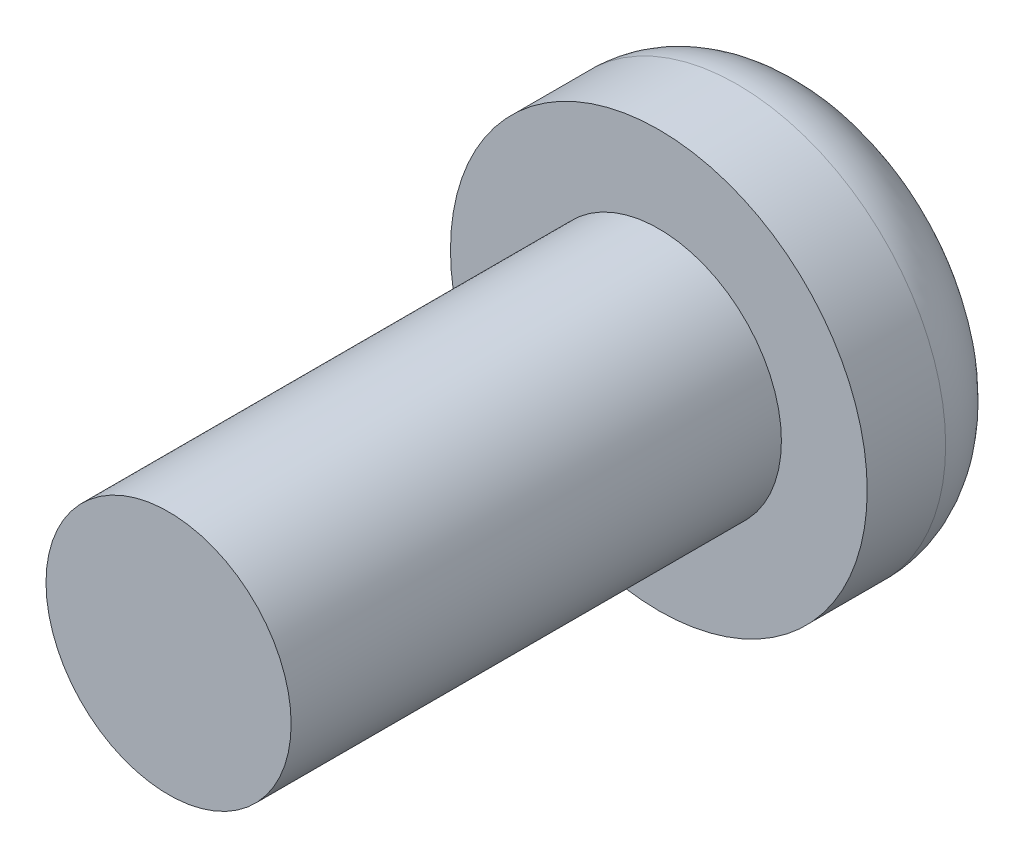
ISO-10303-21;
HEADER;
FILE_DESCRIPTION(('STEP AP214'),'2;1');
FILE_NAME('part.step','',(''),(''),'','','');
FILE_SCHEMA(('AUTOMOTIVE_DESIGN { 1 0 10303 214 1 1 1 1 }'));
ENDSEC;
DATA;
#1=APPLICATION_CONTEXT('core data for automotive mechanical design processes');
#2=APPLICATION_PROTOCOL_DEFINITION('international standard','automotive_design',2000,#1);
#3=PRODUCT_CONTEXT('',#1,'mechanical');
#4=PRODUCT('Part','Part','',(#3));
#5=PRODUCT_RELATED_PRODUCT_CATEGORY('part','',(#4));
#6=PRODUCT_DEFINITION_FORMATION('','',#4);
#7=PRODUCT_DEFINITION_CONTEXT('part definition',#1,'design');
#8=PRODUCT_DEFINITION('design','',#6,#7);
#9=PRODUCT_DEFINITION_SHAPE('','',#8);
#10=(LENGTH_UNIT() NAMED_UNIT(*) SI_UNIT(.MILLI.,.METRE.));
#11=(NAMED_UNIT(*) PLANE_ANGLE_UNIT() SI_UNIT($,.RADIAN.));
#12=(NAMED_UNIT(*) SI_UNIT($,.STERADIAN.) SOLID_ANGLE_UNIT());
#13=UNCERTAINTY_MEASURE_WITH_UNIT(LENGTH_MEASURE(1.E-05),#10,'distance_accuracy_value','');
#14=(GEOMETRIC_REPRESENTATION_CONTEXT(3) GLOBAL_UNCERTAINTY_ASSIGNED_CONTEXT((#13)) GLOBAL_UNIT_ASSIGNED_CONTEXT((#10,
#11,#12)) REPRESENTATION_CONTEXT('',''));
#15=CARTESIAN_POINT('',(0.,0.,0.));
#16=DIRECTION('',(0.,0.,1.));
#17=DIRECTION('',(1.,0.,0.));
#18=AXIS2_PLACEMENT_3D('',#15,#16,#17);
#19=CARTESIAN_POINT('',(0.,0.,3.2));
#20=DIRECTION('',(0.,0.,-1.));
#21=DIRECTION('',(-1.,0.,0.));
#22=AXIS2_PLACEMENT_3D('',#19,#20,#21);
#23=CYLINDRICAL_SURFACE('',#22,4.25);
#24=CARTESIAN_POINT('',(0.,0.,3.2));
#25=DIRECTION('',(0.,0.,1.));
#26=DIRECTION('',(1.,0.,0.));
#27=AXIS2_PLACEMENT_3D('',#24,#25,#26);
#28=CIRCLE('',#27,4.25);
#29=CARTESIAN_POINT('',(4.25,0.,3.2));
#30=VERTEX_POINT('',#29);
#31=EDGE_CURVE('E42',#30,#30,#28,.T.);
#32=ORIENTED_EDGE('',*,*,#31,.F.);
#33=EDGE_LOOP('',(#32));
#34=FACE_BOUND('',#33,.T.);
#35=CARTESIAN_POINT('',(0.,0.,1.6));
#36=DIRECTION('',(0.,0.,-1.));
#37=DIRECTION('',(-1.,0.,0.));
#38=AXIS2_PLACEMENT_3D('',#35,#36,#37);
#39=CIRCLE('',#38,4.25);
#40=CARTESIAN_POINT('',(-4.25,0.,1.6));
#41=VERTEX_POINT('',#40);
#42=EDGE_CURVE('E218',#41,#41,#39,.T.);
#43=ORIENTED_EDGE('',*,*,#42,.F.);
#44=EDGE_LOOP('',(#43));
#45=FACE_BOUND('',#44,.T.);
#46=ADVANCED_FACE('F39',(#34,#45),#23,.T.);
#47=CARTESIAN_POINT('',(0.,0.,3.2));
#48=DIRECTION('',(0.,0.,1.));
#49=DIRECTION('',(1.,0.,0.));
#50=AXIS2_PLACEMENT_3D('',#47,#48,#49);
#51=PLANE('',#50);
#52=CARTESIAN_POINT('',(0.,0.,3.2));
#53=DIRECTION('',(0.,0.,1.));
#54=DIRECTION('',(1.,0.,0.));
#55=AXIS2_PLACEMENT_3D('',#52,#53,#54);
#56=CIRCLE('',#55,2.5);
#57=CARTESIAN_POINT('',(2.5,0.,3.2));
#58=VERTEX_POINT('',#57);
#59=EDGE_CURVE('E11',#58,#58,#56,.T.);
#60=ORIENTED_EDGE('',*,*,#59,.F.);
#61=EDGE_LOOP('',(#60));
#62=FACE_BOUND('',#61,.T.);
#63=ORIENTED_EDGE('',*,*,#31,.T.);
#64=EDGE_LOOP('',(#63));
#65=FACE_BOUND('',#64,.T.);
#66=ADVANCED_FACE('F257',(#62,#65),#51,.T.);
#67=CARTESIAN_POINT('',(0.,0.,1.6));
#68=DIRECTION('',(0.,0.,-1.));
#69=DIRECTION('',(-1.,0.,0.));
#70=AXIS2_PLACEMENT_3D('',#67,#68,#69);
#71=TOROIDAL_SURFACE('',#70,2.65,1.6);
#72=CARTESIAN_POINT('',(0.,0.,0.));
#73=DIRECTION('',(0.,0.,-1.));
#74=DIRECTION('',(-1.,0.,0.));
#75=AXIS2_PLACEMENT_3D('',#72,#73,#74);
#76=CIRCLE('',#75,2.65);
#77=CARTESIAN_POINT('',(-2.65,0.,0.));
#78=VERTEX_POINT('',#77);
#79=EDGE_CURVE('E248',#78,#78,#76,.T.);
#80=ORIENTED_EDGE('',*,*,#79,.F.);
#81=EDGE_LOOP('',(#80));
#82=FACE_BOUND('',#81,.T.);
#83=ORIENTED_EDGE('',*,*,#42,.T.);
#84=EDGE_LOOP('',(#83));
#85=FACE_BOUND('',#84,.T.);
#86=ADVANCED_FACE('F263',(#82,#85),#71,.T.);
#87=CARTESIAN_POINT('',(0.,0.,0.));
#88=DIRECTION('',(0.,0.,1.));
#89=DIRECTION('',(1.,0.,0.));
#90=AXIS2_PLACEMENT_3D('',#87,#88,#89);
#91=PLANE('',#90);
#92=DIRECTION('',(-1.,0.,0.));
#93=VECTOR('',#92,1.);
#94=CARTESIAN_POINT('',(0.,0.5,0.));
#95=LINE('',#94,#93);
#96=CARTESIAN_POINT('',(2.,0.5,0.));
#97=VERTEX_POINT('',#96);
#98=CARTESIAN_POINT('',(0.5,0.5,0.));
#99=VERTEX_POINT('',#98);
#100=EDGE_CURVE('E173',#97,#99,#95,.T.);
#101=ORIENTED_EDGE('',*,*,#100,.T.);
#102=DIRECTION('',(0.,-1.,0.));
#103=VECTOR('',#102,1.);
#104=CARTESIAN_POINT('',(0.5,0.,0.));
#105=LINE('',#104,#103);
#106=CARTESIAN_POINT('',(0.5,2.,0.));
#107=VERTEX_POINT('',#106);
#108=EDGE_CURVE('E55',#107,#99,#105,.T.);
#109=ORIENTED_EDGE('',*,*,#108,.F.);
#110=DIRECTION('',(-1.,0.,0.));
#111=VECTOR('',#110,1.);
#112=CARTESIAN_POINT('',(0.,2.,0.));
#113=LINE('',#112,#111);
#114=CARTESIAN_POINT('',(-0.5,2.,0.));
#115=VERTEX_POINT('',#114);
#116=EDGE_CURVE('E211',#107,#115,#113,.T.);
#117=ORIENTED_EDGE('',*,*,#116,.T.);
#118=DIRECTION('',(0.,-1.,0.));
#119=VECTOR('',#118,1.);
#120=CARTESIAN_POINT('',(-0.5,0.,0.));
#121=LINE('',#120,#119);
#122=CARTESIAN_POINT('',(-0.5,0.5,0.));
#123=VERTEX_POINT('',#122);
#124=EDGE_CURVE('E208',#115,#123,#121,.T.);
#125=ORIENTED_EDGE('',*,*,#124,.T.);
#126=DIRECTION('',(-1.,0.,0.));
#127=VECTOR('',#126,1.);
#128=CARTESIAN_POINT('',(0.,0.5,0.));
#129=LINE('',#128,#127);
#130=CARTESIAN_POINT('',(-2.,0.5,0.));
#131=VERTEX_POINT('',#130);
#132=EDGE_CURVE('E151',#123,#131,#129,.T.);
#133=ORIENTED_EDGE('',*,*,#132,.T.);
#134=DIRECTION('',(0.,-1.,0.));
#135=VECTOR('',#134,1.);
#136=CARTESIAN_POINT('',(-2.,0.,0.));
#137=LINE('',#136,#135);
#138=CARTESIAN_POINT('',(-2.,-0.5,0.));
#139=VERTEX_POINT('',#138);
#140=EDGE_CURVE('E202',#131,#139,#137,.T.);
#141=ORIENTED_EDGE('',*,*,#140,.T.);
#142=DIRECTION('',(-1.,0.,0.));
#143=VECTOR('',#142,1.);
#144=CARTESIAN_POINT('',(0.,-0.5,0.));
#145=LINE('',#144,#143);
#146=CARTESIAN_POINT('',(-0.500000000000001,-0.5,0.));
#147=VERTEX_POINT('',#146);
#148=EDGE_CURVE('E198',#147,#139,#145,.T.);
#149=ORIENTED_EDGE('',*,*,#148,.F.);
#150=DIRECTION('',(0.,-1.,0.));
#151=VECTOR('',#150,1.);
#152=CARTESIAN_POINT('',(-0.5,0.,0.));
#153=LINE('',#152,#151);
#154=CARTESIAN_POINT('',(-0.500000000000001,-2.,0.));
#155=VERTEX_POINT('',#154);
#156=EDGE_CURVE('E194',#147,#155,#153,.T.);
#157=ORIENTED_EDGE('',*,*,#156,.T.);
#158=DIRECTION('',(-1.,0.,0.));
#159=VECTOR('',#158,1.);
#160=CARTESIAN_POINT('',(0.,-2.,0.));
#161=LINE('',#160,#159);
#162=CARTESIAN_POINT('',(0.499999999999999,-2.,0.));
#163=VERTEX_POINT('',#162);
#164=EDGE_CURVE('E190',#163,#155,#161,.T.);
#165=ORIENTED_EDGE('',*,*,#164,.F.);
#166=DIRECTION('',(0.,-1.,0.));
#167=VECTOR('',#166,1.);
#168=CARTESIAN_POINT('',(0.5,0.,0.));
#169=LINE('',#168,#167);
#170=CARTESIAN_POINT('',(0.499999999999999,-0.5,0.));
#171=VERTEX_POINT('',#170);
#172=EDGE_CURVE('E186',#171,#163,#169,.T.);
#173=ORIENTED_EDGE('',*,*,#172,.F.);
#174=DIRECTION('',(-1.,0.,0.));
#175=VECTOR('',#174,1.);
#176=CARTESIAN_POINT('',(0.,-0.5,0.));
#177=LINE('',#176,#175);
#178=CARTESIAN_POINT('',(2.,-0.5,0.));
#179=VERTEX_POINT('',#178);
#180=EDGE_CURVE('E182',#179,#171,#177,.T.);
#181=ORIENTED_EDGE('',*,*,#180,.F.);
#182=DIRECTION('',(0.,-1.,0.));
#183=VECTOR('',#182,1.);
#184=CARTESIAN_POINT('',(2.,0.,0.));
#185=LINE('',#184,#183);
#186=EDGE_CURVE('E178',#97,#179,#185,.T.);
#187=ORIENTED_EDGE('',*,*,#186,.F.);
#188=EDGE_LOOP('',(#101,#109,#117,#125,#133,#141,#149,#157,#165,#173,#181,#187));
#189=FACE_BOUND('',#188,.T.);
#190=ORIENTED_EDGE('',*,*,#79,.T.);
#191=EDGE_LOOP('',(#190));
#192=FACE_BOUND('',#191,.T.);
#193=ADVANCED_FACE('F265',(#189,#192),#91,.F.);
#194=CARTESIAN_POINT('',(0.5,0.,0.5));
#195=DIRECTION('',(1.,0.,0.));
#196=DIRECTION('',(0.,1.,0.));
#197=AXIS2_PLACEMENT_3D('',#194,#195,#196);
#198=PLANE('',#197);
#199=ORIENTED_EDGE('',*,*,#108,.T.);
#200=DIRECTION('',(0.,0.,-1.));
#201=VECTOR('',#200,1.);
#202=CARTESIAN_POINT('',(0.5,0.5,0.5));
#203=LINE('',#202,#201);
#204=CARTESIAN_POINT('',(0.5,0.5,0.5));
#205=VERTEX_POINT('',#204);
#206=EDGE_CURVE('E170',#205,#99,#203,.T.);
#207=ORIENTED_EDGE('',*,*,#206,.F.);
#208=DIRECTION('',(0.,-1.,0.));
#209=VECTOR('',#208,1.);
#210=CARTESIAN_POINT('',(0.5,0.,0.5));
#211=LINE('',#210,#209);
#212=CARTESIAN_POINT('',(0.5,2.,0.5));
#213=VERTEX_POINT('',#212);
#214=EDGE_CURVE('E215',#213,#205,#211,.T.);
#215=ORIENTED_EDGE('',*,*,#214,.F.);
#216=DIRECTION('',(0.,0.,-1.));
#217=VECTOR('',#216,1.);
#218=CARTESIAN_POINT('',(0.5,2.,0.5));
#219=LINE('',#218,#217);
#220=EDGE_CURVE('E63',#213,#107,#219,.T.);
#221=ORIENTED_EDGE('',*,*,#220,.T.);
#222=EDGE_LOOP('',(#199,#207,#215,#221));
#223=FACE_BOUND('',#222,.T.);
#224=ADVANCED_FACE('F272',(#223),#198,.F.);
#225=CARTESIAN_POINT('',(0.,2.,0.5));
#226=DIRECTION('',(0.,-1.,0.));
#227=DIRECTION('',(1.,0.,0.));
#228=AXIS2_PLACEMENT_3D('',#225,#226,#227);
#229=PLANE('',#228);
#230=ORIENTED_EDGE('',*,*,#116,.F.);
#231=ORIENTED_EDGE('',*,*,#220,.F.);
#232=DIRECTION('',(-1.,0.,0.));
#233=VECTOR('',#232,1.);
#234=CARTESIAN_POINT('',(0.,2.,0.5));
#235=LINE('',#234,#233);
#236=CARTESIAN_POINT('',(-0.5,2.,0.5));
#237=VERTEX_POINT('',#236);
#238=EDGE_CURVE('E144',#213,#237,#235,.T.);
#239=ORIENTED_EDGE('',*,*,#238,.T.);
#240=DIRECTION('',(0.,0.,-1.));
#241=VECTOR('',#240,1.);
#242=CARTESIAN_POINT('',(-0.5,2.,0.5));
#243=LINE('',#242,#241);
#244=EDGE_CURVE('E140',#237,#115,#243,.T.);
#245=ORIENTED_EDGE('',*,*,#244,.T.);
#246=EDGE_LOOP('',(#230,#231,#239,#245));
#247=FACE_BOUND('',#246,.T.);
#248=ADVANCED_FACE('F279',(#247),#229,.T.);
#249=CARTESIAN_POINT('',(-0.5,0.,0.5));
#250=DIRECTION('',(1.,0.,0.));
#251=DIRECTION('',(0.,1.,0.));
#252=AXIS2_PLACEMENT_3D('',#249,#250,#251);
#253=PLANE('',#252);
#254=ORIENTED_EDGE('',*,*,#124,.F.);
#255=ORIENTED_EDGE('',*,*,#244,.F.);
#256=DIRECTION('',(0.,-1.,0.));
#257=VECTOR('',#256,1.);
#258=CARTESIAN_POINT('',(-0.5,0.,0.5));
#259=LINE('',#258,#257);
#260=CARTESIAN_POINT('',(-0.5,0.5,0.5));
#261=VERTEX_POINT('',#260);
#262=EDGE_CURVE('E134',#237,#261,#259,.T.);
#263=ORIENTED_EDGE('',*,*,#262,.T.);
#264=DIRECTION('',(0.,0.,-1.));
#265=VECTOR('',#264,1.);
#266=CARTESIAN_POINT('',(-0.5,0.5,0.5));
#267=LINE('',#266,#265);
#268=EDGE_CURVE('E138',#261,#123,#267,.T.);
#269=ORIENTED_EDGE('',*,*,#268,.T.);
#270=EDGE_LOOP('',(#254,#255,#263,#269));
#271=FACE_BOUND('',#270,.T.);
#272=ADVANCED_FACE('F137',(#271),#253,.T.);
#273=CARTESIAN_POINT('',(0.,0.5,0.5));
#274=DIRECTION('',(0.,-1.,0.));
#275=DIRECTION('',(1.,0.,0.));
#276=AXIS2_PLACEMENT_3D('',#273,#274,#275);
#277=PLANE('',#276);
#278=ORIENTED_EDGE('',*,*,#132,.F.);
#279=ORIENTED_EDGE('',*,*,#268,.F.);
#280=DIRECTION('',(-1.,0.,0.));
#281=VECTOR('',#280,1.);
#282=CARTESIAN_POINT('',(0.,0.5,0.5));
#283=LINE('',#282,#281);
#284=CARTESIAN_POINT('',(-2.,0.5,0.5));
#285=VERTEX_POINT('',#284);
#286=EDGE_CURVE('E145',#261,#285,#283,.T.);
#287=ORIENTED_EDGE('',*,*,#286,.T.);
#288=DIRECTION('',(0.,0.,-1.));
#289=VECTOR('',#288,1.);
#290=CARTESIAN_POINT('',(-2.,0.5,0.5));
#291=LINE('',#290,#289);
#292=EDGE_CURVE('E154',#285,#131,#291,.T.);
#293=ORIENTED_EDGE('',*,*,#292,.T.);
#294=EDGE_LOOP('',(#278,#279,#287,#293));
#295=FACE_BOUND('',#294,.T.);
#296=ADVANCED_FACE('F148',(#295),#277,.T.);
#297=CARTESIAN_POINT('',(-2.,0.,0.5));
#298=DIRECTION('',(1.,0.,0.));
#299=DIRECTION('',(0.,1.,0.));
#300=AXIS2_PLACEMENT_3D('',#297,#298,#299);
#301=PLANE('',#300);
#302=ORIENTED_EDGE('',*,*,#140,.F.);
#303=ORIENTED_EDGE('',*,*,#292,.F.);
#304=DIRECTION('',(0.,-1.,0.));
#305=VECTOR('',#304,1.);
#306=CARTESIAN_POINT('',(-2.,0.,0.5));
#307=LINE('',#306,#305);
#308=CARTESIAN_POINT('',(-2.,-0.5,0.5));
#309=VERTEX_POINT('',#308);
#310=EDGE_CURVE('E160',#285,#309,#307,.T.);
#311=ORIENTED_EDGE('',*,*,#310,.T.);
#312=DIRECTION('',(0.,0.,-1.));
#313=VECTOR('',#312,1.);
#314=CARTESIAN_POINT('',(-2.,-0.5,0.5));
#315=LINE('',#314,#313);
#316=EDGE_CURVE('E223',#309,#139,#315,.T.);
#317=ORIENTED_EDGE('',*,*,#316,.T.);
#318=EDGE_LOOP('',(#302,#303,#311,#317));
#319=FACE_BOUND('',#318,.T.);
#320=ADVANCED_FACE('F306',(#319),#301,.T.);
#321=CARTESIAN_POINT('',(0.,-0.5,0.5));
#322=DIRECTION('',(0.,-1.,0.));
#323=DIRECTION('',(0.,0.,-1.));
#324=AXIS2_PLACEMENT_3D('',#321,#322,#323);
#325=PLANE('',#324);
#326=ORIENTED_EDGE('',*,*,#148,.T.);
#327=ORIENTED_EDGE('',*,*,#316,.F.);
#328=DIRECTION('',(-1.,0.,0.));
#329=VECTOR('',#328,1.);
#330=CARTESIAN_POINT('',(0.,-0.5,0.5));
#331=LINE('',#330,#329);
#332=CARTESIAN_POINT('',(-0.500000000000001,-0.5,0.5));
#333=VERTEX_POINT('',#332);
#334=EDGE_CURVE('E164',#333,#309,#331,.T.);
#335=ORIENTED_EDGE('',*,*,#334,.F.);
#336=DIRECTION('',(0.,0.,-1.));
#337=VECTOR('',#336,1.);
#338=CARTESIAN_POINT('',(-0.500000000000001,-0.5,0.5));
#339=LINE('',#338,#337);
#340=EDGE_CURVE('E226',#333,#147,#339,.T.);
#341=ORIENTED_EDGE('',*,*,#340,.T.);
#342=EDGE_LOOP('',(#326,#327,#335,#341));
#343=FACE_BOUND('',#342,.T.);
#344=ADVANCED_FACE('F302',(#343),#325,.F.);
#345=CARTESIAN_POINT('',(-0.5,0.,0.5));
#346=DIRECTION('',(1.,0.,0.));
#347=DIRECTION('',(0.,1.,0.));
#348=AXIS2_PLACEMENT_3D('',#345,#346,#347);
#349=PLANE('',#348);
#350=ORIENTED_EDGE('',*,*,#156,.F.);
#351=ORIENTED_EDGE('',*,*,#340,.F.);
#352=DIRECTION('',(0.,-1.,0.));
#353=VECTOR('',#352,1.);
#354=CARTESIAN_POINT('',(-0.5,0.,0.5));
#355=LINE('',#354,#353);
#356=CARTESIAN_POINT('',(-0.500000000000001,-2.,0.5));
#357=VERTEX_POINT('',#356);
#358=EDGE_CURVE('E353',#333,#357,#355,.T.);
#359=ORIENTED_EDGE('',*,*,#358,.T.);
#360=DIRECTION('',(0.,0.,-1.));
#361=VECTOR('',#360,1.);
#362=CARTESIAN_POINT('',(-0.500000000000001,-2.,0.5));
#363=LINE('',#362,#361);
#364=EDGE_CURVE('E229',#357,#155,#363,.T.);
#365=ORIENTED_EDGE('',*,*,#364,.T.);
#366=EDGE_LOOP('',(#350,#351,#359,#365));
#367=FACE_BOUND('',#366,.T.);
#368=ADVANCED_FACE('F298',(#367),#349,.T.);
#369=CARTESIAN_POINT('',(0.,-2.,0.5));
#370=DIRECTION('',(0.,-1.,0.));
#371=DIRECTION('',(0.,0.,-1.));
#372=AXIS2_PLACEMENT_3D('',#369,#370,#371);
#373=PLANE('',#372);
#374=ORIENTED_EDGE('',*,*,#164,.T.);
#375=ORIENTED_EDGE('',*,*,#364,.F.);
#376=DIRECTION('',(-1.,0.,0.));
#377=VECTOR('',#376,1.);
#378=CARTESIAN_POINT('',(0.,-2.,0.5));
#379=LINE('',#378,#377);
#380=CARTESIAN_POINT('',(0.499999999999999,-2.,0.5));
#381=VERTEX_POINT('',#380);
#382=EDGE_CURVE('E349',#381,#357,#379,.T.);
#383=ORIENTED_EDGE('',*,*,#382,.F.);
#384=DIRECTION('',(0.,0.,-1.));
#385=VECTOR('',#384,1.);
#386=CARTESIAN_POINT('',(0.499999999999999,-2.,0.5));
#387=LINE('',#386,#385);
#388=EDGE_CURVE('E232',#381,#163,#387,.T.);
#389=ORIENTED_EDGE('',*,*,#388,.T.);
#390=EDGE_LOOP('',(#374,#375,#383,#389));
#391=FACE_BOUND('',#390,.T.);
#392=ADVANCED_FACE('F294',(#391),#373,.F.);
#393=CARTESIAN_POINT('',(0.5,0.,0.5));
#394=DIRECTION('',(1.,0.,0.));
#395=DIRECTION('',(0.,1.,0.));
#396=AXIS2_PLACEMENT_3D('',#393,#394,#395);
#397=PLANE('',#396);
#398=ORIENTED_EDGE('',*,*,#172,.T.);
#399=ORIENTED_EDGE('',*,*,#388,.F.);
#400=DIRECTION('',(0.,-1.,0.));
#401=VECTOR('',#400,1.);
#402=CARTESIAN_POINT('',(0.5,0.,0.5));
#403=LINE('',#402,#401);
#404=CARTESIAN_POINT('',(0.499999999999999,-0.5,0.5));
#405=VERTEX_POINT('',#404);
#406=EDGE_CURVE('E345',#405,#381,#403,.T.);
#407=ORIENTED_EDGE('',*,*,#406,.F.);
#408=DIRECTION('',(0.,0.,-1.));
#409=VECTOR('',#408,1.);
#410=CARTESIAN_POINT('',(0.499999999999999,-0.5,0.5));
#411=LINE('',#410,#409);
#412=EDGE_CURVE('E235',#405,#171,#411,.T.);
#413=ORIENTED_EDGE('',*,*,#412,.T.);
#414=EDGE_LOOP('',(#398,#399,#407,#413));
#415=FACE_BOUND('',#414,.T.);
#416=ADVANCED_FACE('F290',(#415),#397,.F.);
#417=CARTESIAN_POINT('',(0.,-0.5,0.5));
#418=DIRECTION('',(0.,-1.,0.));
#419=DIRECTION('',(0.,0.,-1.));
#420=AXIS2_PLACEMENT_3D('',#417,#418,#419);
#421=PLANE('',#420);
#422=ORIENTED_EDGE('',*,*,#180,.T.);
#423=ORIENTED_EDGE('',*,*,#412,.F.);
#424=DIRECTION('',(-1.,0.,0.));
#425=VECTOR('',#424,1.);
#426=CARTESIAN_POINT('',(0.,-0.5,0.5));
#427=LINE('',#426,#425);
#428=CARTESIAN_POINT('',(2.,-0.5,0.5));
#429=VERTEX_POINT('',#428);
#430=EDGE_CURVE('E341',#429,#405,#427,.T.);
#431=ORIENTED_EDGE('',*,*,#430,.F.);
#432=DIRECTION('',(0.,0.,-1.));
#433=VECTOR('',#432,1.);
#434=CARTESIAN_POINT('',(2.,-0.5,0.5));
#435=LINE('',#434,#433);
#436=EDGE_CURVE('E238',#429,#179,#435,.T.);
#437=ORIENTED_EDGE('',*,*,#436,.T.);
#438=EDGE_LOOP('',(#422,#423,#431,#437));
#439=FACE_BOUND('',#438,.T.);
#440=ADVANCED_FACE('F286',(#439),#421,.F.);
#441=CARTESIAN_POINT('',(2.,0.,0.5));
#442=DIRECTION('',(1.,0.,0.));
#443=DIRECTION('',(0.,1.,0.));
#444=AXIS2_PLACEMENT_3D('',#441,#442,#443);
#445=PLANE('',#444);
#446=ORIENTED_EDGE('',*,*,#186,.T.);
#447=ORIENTED_EDGE('',*,*,#436,.F.);
#448=DIRECTION('',(0.,-1.,0.));
#449=VECTOR('',#448,1.);
#450=CARTESIAN_POINT('',(2.,0.,0.5));
#451=LINE('',#450,#449);
#452=CARTESIAN_POINT('',(2.,0.5,0.5));
#453=VERTEX_POINT('',#452);
#454=EDGE_CURVE('E337',#453,#429,#451,.T.);
#455=ORIENTED_EDGE('',*,*,#454,.F.);
#456=DIRECTION('',(0.,0.,-1.));
#457=VECTOR('',#456,1.);
#458=CARTESIAN_POINT('',(2.,0.5,0.5));
#459=LINE('',#458,#457);
#460=EDGE_CURVE('E241',#453,#97,#459,.T.);
#461=ORIENTED_EDGE('',*,*,#460,.T.);
#462=EDGE_LOOP('',(#446,#447,#455,#461));
#463=FACE_BOUND('',#462,.T.);
#464=ADVANCED_FACE('F283',(#463),#445,.F.);
#465=CARTESIAN_POINT('',(0.,0.5,0.5));
#466=DIRECTION('',(0.,-1.,0.));
#467=DIRECTION('',(1.,0.,0.));
#468=AXIS2_PLACEMENT_3D('',#465,#466,#467);
#469=PLANE('',#468);
#470=ORIENTED_EDGE('',*,*,#100,.F.);
#471=ORIENTED_EDGE('',*,*,#460,.F.);
#472=DIRECTION('',(-1.,0.,0.));
#473=VECTOR('',#472,1.);
#474=CARTESIAN_POINT('',(0.,0.5,0.5));
#475=LINE('',#474,#473);
#476=EDGE_CURVE('E107',#453,#205,#475,.T.);
#477=ORIENTED_EDGE('',*,*,#476,.T.);
#478=ORIENTED_EDGE('',*,*,#206,.T.);
#479=EDGE_LOOP('',(#470,#471,#477,#478));
#480=FACE_BOUND('',#479,.T.);
#481=ADVANCED_FACE('F280',(#480),#469,.T.);
#482=CARTESIAN_POINT('',(0.,0.,0.5));
#483=DIRECTION('',(0.,0.,-1.));
#484=DIRECTION('',(-1.,0.,0.));
#485=AXIS2_PLACEMENT_3D('',#482,#483,#484);
#486=PLANE('',#485);
#487=ORIENTED_EDGE('',*,*,#214,.T.);
#488=ORIENTED_EDGE('',*,*,#476,.F.);
#489=ORIENTED_EDGE('',*,*,#454,.T.);
#490=ORIENTED_EDGE('',*,*,#430,.T.);
#491=ORIENTED_EDGE('',*,*,#406,.T.);
#492=ORIENTED_EDGE('',*,*,#382,.T.);
#493=ORIENTED_EDGE('',*,*,#358,.F.);
#494=ORIENTED_EDGE('',*,*,#334,.T.);
#495=ORIENTED_EDGE('',*,*,#310,.F.);
#496=ORIENTED_EDGE('',*,*,#286,.F.);
#497=ORIENTED_EDGE('',*,*,#262,.F.);
#498=ORIENTED_EDGE('',*,*,#238,.F.);
#499=EDGE_LOOP('',(#487,#488,#489,#490,#491,#492,#493,#494,#495,#496,#497,#498));
#500=FACE_BOUND('',#499,.T.);
#501=ADVANCED_FACE('F158',(#500),#486,.T.);
#502=CARTESIAN_POINT('',(0.,0.,13.2));
#503=DIRECTION('',(0.,0.,-1.));
#504=DIRECTION('',(-1.,0.,0.));
#505=AXIS2_PLACEMENT_3D('',#502,#503,#504);
#506=CYLINDRICAL_SURFACE('',#505,2.5);
#507=CARTESIAN_POINT('',(0.,0.,13.2));
#508=DIRECTION('',(0.,0.,1.));
#509=DIRECTION('',(1.,0.,0.));
#510=AXIS2_PLACEMENT_3D('',#507,#508,#509);
#511=CIRCLE('',#510,2.5);
#512=CARTESIAN_POINT('',(2.5,0.,13.2));
#513=VERTEX_POINT('',#512);
#514=EDGE_CURVE('E174',#513,#513,#511,.T.);
#515=ORIENTED_EDGE('',*,*,#514,.F.);
#516=EDGE_LOOP('',(#515));
#517=FACE_BOUND('',#516,.T.);
#518=ORIENTED_EDGE('',*,*,#59,.T.);
#519=EDGE_LOOP('',(#518));
#520=FACE_BOUND('',#519,.T.);
#521=ADVANCED_FACE('F319',(#517,#520),#506,.T.);
#522=CARTESIAN_POINT('',(0.,0.,13.2));
#523=DIRECTION('',(0.,0.,1.));
#524=DIRECTION('',(1.,0.,0.));
#525=AXIS2_PLACEMENT_3D('',#522,#523,#524);
#526=PLANE('',#525);
#527=ORIENTED_EDGE('',*,*,#514,.T.);
#528=EDGE_LOOP('',(#527));
#529=FACE_BOUND('',#528,.T.);
#530=ADVANCED_FACE('F322',(#529),#526,.T.);
#531=CLOSED_SHELL('',(#46,#66,#86,#193,#224,#248,#272,#296,#320,#344,#368,#392,#416,#440,#464,
#481,#501,#521,#530));
#532=MANIFOLD_SOLID_BREP('B2',#531);
#533=ADVANCED_BREP_SHAPE_REPRESENTATION('',(#18,#532),#14);
#534=SHAPE_DEFINITION_REPRESENTATION(#9,#533);
ENDSEC;
END-ISO-10303-21;
